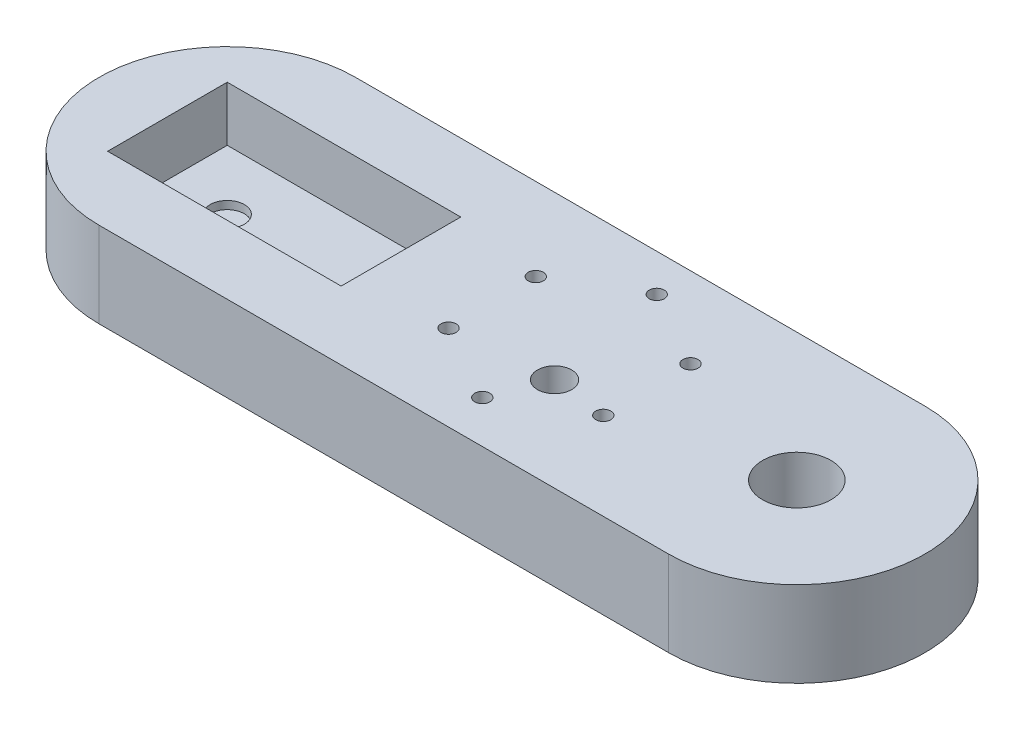
ISO-10303-21;
HEADER;
FILE_DESCRIPTION(('STEP AP214'),'2;1');
FILE_NAME('part.step','',(''),(''),'','','');
FILE_SCHEMA(('AUTOMOTIVE_DESIGN { 1 0 10303 214 1 1 1 1 }'));
ENDSEC;
DATA;
#1=APPLICATION_CONTEXT('core data for automotive mechanical design processes');
#2=APPLICATION_PROTOCOL_DEFINITION('international standard','automotive_design',2000,#1);
#3=PRODUCT_CONTEXT('',#1,'mechanical');
#4=PRODUCT('Part','Part','',(#3));
#5=PRODUCT_RELATED_PRODUCT_CATEGORY('part','',(#4));
#6=PRODUCT_DEFINITION_FORMATION('','',#4);
#7=PRODUCT_DEFINITION_CONTEXT('part definition',#1,'design');
#8=PRODUCT_DEFINITION('design','',#6,#7);
#9=PRODUCT_DEFINITION_SHAPE('','',#8);
#10=(LENGTH_UNIT() NAMED_UNIT(*) SI_UNIT(.MILLI.,.METRE.));
#11=(NAMED_UNIT(*) PLANE_ANGLE_UNIT() SI_UNIT($,.RADIAN.));
#12=(NAMED_UNIT(*) SI_UNIT($,.STERADIAN.) SOLID_ANGLE_UNIT());
#13=UNCERTAINTY_MEASURE_WITH_UNIT(LENGTH_MEASURE(1.E-05),#10,'distance_accuracy_value','');
#14=(GEOMETRIC_REPRESENTATION_CONTEXT(3) GLOBAL_UNCERTAINTY_ASSIGNED_CONTEXT((#13)) GLOBAL_UNIT_ASSIGNED_CONTEXT((#10,
#11,#12)) REPRESENTATION_CONTEXT('',''));
#15=CARTESIAN_POINT('',(0.,0.,0.));
#16=DIRECTION('',(0.,0.,1.));
#17=DIRECTION('',(1.,0.,0.));
#18=AXIS2_PLACEMENT_3D('',#15,#16,#17);
#19=CARTESIAN_POINT('',(0.,-8.48528137423855,0.));
#20=DIRECTION('',(0.,1.,0.));
#21=DIRECTION('',(0.,0.,1.));
#22=AXIS2_PLACEMENT_3D('',#19,#20,#21);
#23=CYLINDRICAL_SURFACE('',#22,3.);
#24=CARTESIAN_POINT('',(0.,5.4,0.));
#25=DIRECTION('',(0.,1.,0.));
#26=DIRECTION('',(0.,0.,1.));
#27=AXIS2_PLACEMENT_3D('',#24,#25,#26);
#28=CIRCLE('',#27,3.);
#29=CARTESIAN_POINT('',(0.,5.4,3.));
#30=VERTEX_POINT('',#29);
#31=EDGE_CURVE('E200',#30,#30,#28,.F.);
#32=ORIENTED_EDGE('',*,*,#31,.F.);
#33=EDGE_LOOP('',(#32));
#34=FACE_BOUND('',#33,.T.);
#35=DIRECTION('',(0.,1.,0.));
#36=VECTOR('',#35,1.);
#37=CARTESIAN_POINT('',(2.5,-8.48528137423855,1.6583123951777));
#38=LINE('',#37,#36);
#39=CARTESIAN_POINT('',(2.5,4.,1.6583123951777));
#40=VERTEX_POINT('',#39);
#41=CARTESIAN_POINT('',(2.5,0.,1.6583123951777));
#42=VERTEX_POINT('',#41);
#43=EDGE_CURVE('E11',#40,#42,#38,.F.);
#44=ORIENTED_EDGE('',*,*,#43,.F.);
#45=CARTESIAN_POINT('',(0.,4.,0.));
#46=DIRECTION('',(0.,1.,0.));
#47=DIRECTION('',(0.,0.,1.));
#48=AXIS2_PLACEMENT_3D('',#45,#46,#47);
#49=CIRCLE('',#48,3.);
#50=CARTESIAN_POINT('',(2.5,4.,-1.6583123951777));
#51=VERTEX_POINT('',#50);
#52=EDGE_CURVE('E48',#40,#51,#49,.F.);
#53=ORIENTED_EDGE('',*,*,#52,.T.);
#54=DIRECTION('',(0.,1.,0.));
#55=VECTOR('',#54,1.);
#56=CARTESIAN_POINT('',(2.5,-8.48528137423855,-1.6583123951777));
#57=LINE('',#56,#55);
#58=CARTESIAN_POINT('',(2.5,0.,-1.6583123951777));
#59=VERTEX_POINT('',#58);
#60=EDGE_CURVE('E191',#59,#51,#57,.T.);
#61=ORIENTED_EDGE('',*,*,#60,.F.);
#62=CARTESIAN_POINT('',(0.,0.,0.));
#63=DIRECTION('',(0.,1.,0.));
#64=DIRECTION('',(-1.,0.,0.));
#65=AXIS2_PLACEMENT_3D('',#62,#63,#64);
#66=CIRCLE('',#65,3.);
#67=EDGE_CURVE('E202',#59,#42,#66,.F.);
#68=ORIENTED_EDGE('',*,*,#67,.T.);
#69=EDGE_LOOP('',(#44,#53,#61,#68));
#70=FACE_BOUND('',#69,.T.);
#71=ADVANCED_FACE('F39',(#34,#70),#23,.F.);
#72=CARTESIAN_POINT('',(0.,15.,0.));
#73=DIRECTION('',(0.,-1.,0.));
#74=DIRECTION('',(0.,0.,-1.));
#75=AXIS2_PLACEMENT_3D('',#72,#73,#74);
#76=CYLINDRICAL_SURFACE('',#75,22.5);
#77=CARTESIAN_POINT('',(0.,0.,0.));
#78=DIRECTION('',(0.,1.,0.));
#79=DIRECTION('',(0.,0.,1.));
#80=AXIS2_PLACEMENT_3D('',#77,#78,#79);
#81=CIRCLE('',#80,22.5);
#82=CARTESIAN_POINT('',(0.,0.,-22.5));
#83=VERTEX_POINT('',#82);
#84=CARTESIAN_POINT('',(-18.7082869338697,0.,-12.5));
#85=VERTEX_POINT('',#84);
#86=EDGE_CURVE('E332',#83,#85,#81,.T.);
#87=ORIENTED_EDGE('',*,*,#86,.T.);
#88=DIRECTION('',(0.,-1.,0.));
#89=VECTOR('',#88,1.);
#90=CARTESIAN_POINT('',(-18.7082869338697,15.,-12.5));
#91=LINE('',#90,#89);
#92=CARTESIAN_POINT('',(-18.7082869338697,4.,-12.5));
#93=VERTEX_POINT('',#92);
#94=EDGE_CURVE('E151',#85,#93,#91,.F.);
#95=ORIENTED_EDGE('',*,*,#94,.T.);
#96=CARTESIAN_POINT('',(0.,4.,0.));
#97=DIRECTION('',(0.,1.,0.));
#98=DIRECTION('',(0.,0.,1.));
#99=AXIS2_PLACEMENT_3D('',#96,#97,#98);
#100=CIRCLE('',#99,22.5);
#101=CARTESIAN_POINT('',(-18.7082869338697,4.,12.5));
#102=VERTEX_POINT('',#101);
#103=EDGE_CURVE('E399',#93,#102,#100,.T.);
#104=ORIENTED_EDGE('',*,*,#103,.T.);
#105=DIRECTION('',(0.,-1.,0.));
#106=VECTOR('',#105,1.);
#107=CARTESIAN_POINT('',(-18.7082869338697,15.,12.5));
#108=LINE('',#107,#106);
#109=CARTESIAN_POINT('',(-18.7082869338697,0.,12.5));
#110=VERTEX_POINT('',#109);
#111=EDGE_CURVE('E397',#102,#110,#108,.T.);
#112=ORIENTED_EDGE('',*,*,#111,.T.);
#113=CARTESIAN_POINT('',(0.,0.,22.5));
#114=VERTEX_POINT('',#113);
#115=EDGE_CURVE('E358',#110,#114,#81,.T.);
#116=ORIENTED_EDGE('',*,*,#115,.T.);
#117=DIRECTION('',(0.,-1.,0.));
#118=VECTOR('',#117,1.);
#119=CARTESIAN_POINT('',(0.,15.,22.5));
#120=LINE('',#119,#118);
#121=CARTESIAN_POINT('',(0.,15.,22.5));
#122=VERTEX_POINT('',#121);
#123=EDGE_CURVE('E192',#122,#114,#120,.T.);
#124=ORIENTED_EDGE('',*,*,#123,.F.);
#125=CARTESIAN_POINT('',(0.,15.,0.));
#126=DIRECTION('',(0.,1.,0.));
#127=DIRECTION('',(0.,0.,1.));
#128=AXIS2_PLACEMENT_3D('',#125,#126,#127);
#129=CIRCLE('',#128,22.5);
#130=CARTESIAN_POINT('',(0.,15.,-22.5));
#131=VERTEX_POINT('',#130);
#132=EDGE_CURVE('E341',#131,#122,#129,.T.);
#133=ORIENTED_EDGE('',*,*,#132,.F.);
#134=DIRECTION('',(0.,-1.,0.));
#135=VECTOR('',#134,1.);
#136=CARTESIAN_POINT('',(0.,15.,-22.5));
#137=LINE('',#136,#135);
#138=EDGE_CURVE('E345',#131,#83,#137,.T.);
#139=ORIENTED_EDGE('',*,*,#138,.T.);
#140=EDGE_LOOP('',(#87,#95,#104,#112,#116,#124,#133,#139));
#141=FACE_BOUND('',#140,.T.);
#142=ADVANCED_FACE('F41',(#141),#76,.T.);
#143=CARTESIAN_POINT('',(0.,15.,22.5));
#144=DIRECTION('',(0.,0.,-1.));
#145=DIRECTION('',(-1.,0.,0.));
#146=AXIS2_PLACEMENT_3D('',#143,#144,#145);
#147=PLANE('',#146);
#148=DIRECTION('',(1.,0.,0.));
#149=VECTOR('',#148,1.);
#150=CARTESIAN_POINT('',(0.,0.,22.5));
#151=LINE('',#150,#149);
#152=CARTESIAN_POINT('',(100.,0.,22.5));
#153=VERTEX_POINT('',#152);
#154=EDGE_CURVE('E326',#114,#153,#151,.T.);
#155=ORIENTED_EDGE('',*,*,#154,.T.);
#156=DIRECTION('',(0.,-1.,0.));
#157=VECTOR('',#156,1.);
#158=CARTESIAN_POINT('',(100.,15.,22.5));
#159=LINE('',#158,#157);
#160=CARTESIAN_POINT('',(100.,15.,22.5));
#161=VERTEX_POINT('',#160);
#162=EDGE_CURVE('E196',#161,#153,#159,.T.);
#163=ORIENTED_EDGE('',*,*,#162,.F.);
#164=DIRECTION('',(1.,0.,0.));
#165=VECTOR('',#164,1.);
#166=CARTESIAN_POINT('',(0.,15.,22.5));
#167=LINE('',#166,#165);
#168=EDGE_CURVE('E355',#122,#161,#167,.T.);
#169=ORIENTED_EDGE('',*,*,#168,.F.);
#170=ORIENTED_EDGE('',*,*,#123,.T.);
#171=EDGE_LOOP('',(#155,#163,#169,#170));
#172=FACE_BOUND('',#171,.T.);
#173=ADVANCED_FACE('F294',(#172),#147,.F.);
#174=CARTESIAN_POINT('',(100.,15.,0.));
#175=DIRECTION('',(0.,-1.,0.));
#176=DIRECTION('',(0.,0.,-1.));
#177=AXIS2_PLACEMENT_3D('',#174,#175,#176);
#178=CYLINDRICAL_SURFACE('',#177,22.5);
#179=CARTESIAN_POINT('',(100.,0.,0.));
#180=DIRECTION('',(0.,1.,0.));
#181=DIRECTION('',(0.,0.,1.));
#182=AXIS2_PLACEMENT_3D('',#179,#180,#181);
#183=CIRCLE('',#182,22.5);
#184=CARTESIAN_POINT('',(100.,0.,-22.5));
#185=VERTEX_POINT('',#184);
#186=EDGE_CURVE('E331',#153,#185,#183,.T.);
#187=ORIENTED_EDGE('',*,*,#186,.T.);
#188=DIRECTION('',(0.,-1.,0.));
#189=VECTOR('',#188,1.);
#190=CARTESIAN_POINT('',(100.,15.,-22.5));
#191=LINE('',#190,#189);
#192=CARTESIAN_POINT('',(100.,15.,-22.5));
#193=VERTEX_POINT('',#192);
#194=EDGE_CURVE('E337',#193,#185,#191,.T.);
#195=ORIENTED_EDGE('',*,*,#194,.F.);
#196=CARTESIAN_POINT('',(100.,15.,0.));
#197=DIRECTION('',(0.,1.,0.));
#198=DIRECTION('',(0.,0.,1.));
#199=AXIS2_PLACEMENT_3D('',#196,#197,#198);
#200=CIRCLE('',#199,22.5);
#201=EDGE_CURVE('E336',#161,#193,#200,.T.);
#202=ORIENTED_EDGE('',*,*,#201,.F.);
#203=ORIENTED_EDGE('',*,*,#162,.T.);
#204=EDGE_LOOP('',(#187,#195,#202,#203));
#205=FACE_BOUND('',#204,.T.);
#206=ADVANCED_FACE('F315',(#205),#178,.T.);
#207=CARTESIAN_POINT('',(0.,15.,-22.5));
#208=DIRECTION('',(0.,0.,1.));
#209=DIRECTION('',(1.,0.,0.));
#210=AXIS2_PLACEMENT_3D('',#207,#208,#209);
#211=PLANE('',#210);
#212=DIRECTION('',(-1.,0.,0.));
#213=VECTOR('',#212,1.);
#214=CARTESIAN_POINT('',(0.,0.,-22.5));
#215=LINE('',#214,#213);
#216=EDGE_CURVE('E339',#185,#83,#215,.T.);
#217=ORIENTED_EDGE('',*,*,#216,.T.);
#218=ORIENTED_EDGE('',*,*,#138,.F.);
#219=DIRECTION('',(-1.,0.,0.));
#220=VECTOR('',#219,1.);
#221=CARTESIAN_POINT('',(0.,15.,-22.5));
#222=LINE('',#221,#220);
#223=EDGE_CURVE('E348',#193,#131,#222,.T.);
#224=ORIENTED_EDGE('',*,*,#223,.F.);
#225=ORIENTED_EDGE('',*,*,#194,.T.);
#226=EDGE_LOOP('',(#217,#218,#224,#225));
#227=FACE_BOUND('',#226,.T.);
#228=ADVANCED_FACE('F310',(#227),#211,.F.);
#229=CARTESIAN_POINT('',(0.,15.,0.));
#230=DIRECTION('',(0.,1.,0.));
#231=DIRECTION('',(0.,0.,1.));
#232=AXIS2_PLACEMENT_3D('',#229,#230,#231);
#233=PLANE('',#232);
#234=CARTESIAN_POINT('',(59.4694543473453,15.,-15.9397721773031));
#235=DIRECTION('',(0.,-1.,0.));
#236=DIRECTION('',(0.,0.,-1.));
#237=AXIS2_PLACEMENT_3D('',#234,#235,#236);
#238=CIRCLE('',#237,1.32501182149046);
#239=CARTESIAN_POINT('',(59.4694543473453,15.,-17.2647839987936));
#240=VERTEX_POINT('',#239);
#241=EDGE_CURVE('E231',#240,#240,#238,.T.);
#242=ORIENTED_EDGE('',*,*,#241,.T.);
#243=EDGE_LOOP('',(#242));
#244=FACE_BOUND('',#243,.T.);
#245=CARTESIAN_POINT('',(72.9840265990423,15.,-8.34988832748964));
#246=DIRECTION('',(0.,-1.,0.));
#247=DIRECTION('',(0.,0.,-1.));
#248=AXIS2_PLACEMENT_3D('',#245,#246,#247);
#249=CIRCLE('',#248,1.32501182149055);
#250=CARTESIAN_POINT('',(72.9840265990423,15.,-9.67490014898019));
#251=VERTEX_POINT('',#250);
#252=EDGE_CURVE('E237',#251,#251,#249,.T.);
#253=ORIENTED_EDGE('',*,*,#252,.T.);
#254=EDGE_LOOP('',(#253));
#255=FACE_BOUND('',#254,.T.);
#256=CARTESIAN_POINT('',(73.1682804991791,15.,7.14901648866706));
#257=DIRECTION('',(0.,-1.,0.));
#258=DIRECTION('',(0.,0.,-1.));
#259=AXIS2_PLACEMENT_3D('',#256,#257,#258);
#260=CIRCLE('',#259,1.32501182149096);
#261=CARTESIAN_POINT('',(73.1682804991791,15.,5.8240046671761));
#262=VERTEX_POINT('',#261);
#263=EDGE_CURVE('E243',#262,#262,#260,.T.);
#264=ORIENTED_EDGE('',*,*,#263,.T.);
#265=EDGE_LOOP('',(#264));
#266=FACE_BOUND('',#265,.T.);
#267=CARTESIAN_POINT('',(59.8379621476188,15.,15.0580374550102));
#268=DIRECTION('',(0.,-1.,0.));
#269=DIRECTION('',(0.,0.,-1.));
#270=AXIS2_PLACEMENT_3D('',#267,#268,#269);
#271=CIRCLE('',#270,1.32501182149128);
#272=CARTESIAN_POINT('',(59.8379621476188,15.,13.7330256335189));
#273=VERTEX_POINT('',#272);
#274=EDGE_CURVE('E249',#273,#273,#271,.T.);
#275=ORIENTED_EDGE('',*,*,#274,.T.);
#276=EDGE_LOOP('',(#275));
#277=FACE_BOUND('',#276,.T.);
#278=CARTESIAN_POINT('',(46.3233898959218,15.,7.46815360519682));
#279=DIRECTION('',(0.,-1.,0.));
#280=DIRECTION('',(0.,0.,-1.));
#281=AXIS2_PLACEMENT_3D('',#278,#279,#280);
#282=CIRCLE('',#281,1.32501182149119);
#283=CARTESIAN_POINT('',(46.3233898959218,15.,6.14314178370564));
#284=VERTEX_POINT('',#283);
#285=EDGE_CURVE('E226',#284,#284,#282,.T.);
#286=ORIENTED_EDGE('',*,*,#285,.T.);
#287=EDGE_LOOP('',(#286));
#288=FACE_BOUND('',#287,.T.);
#289=CARTESIAN_POINT('',(46.1391359957849,15.,-8.03075121095988));
#290=DIRECTION('',(0.,-1.,0.));
#291=DIRECTION('',(0.,0.,-1.));
#292=AXIS2_PLACEMENT_3D('',#289,#290,#291);
#293=CIRCLE('',#292,1.32501182149078);
#294=CARTESIAN_POINT('',(46.1391359957849,15.,-9.35576303245066));
#295=VERTEX_POINT('',#294);
#296=EDGE_CURVE('E217',#295,#295,#293,.T.);
#297=ORIENTED_EDGE('',*,*,#296,.T.);
#298=EDGE_LOOP('',(#297));
#299=FACE_BOUND('',#298,.T.);
#300=CARTESIAN_POINT('',(63.4806538763577,15.,6.0092866799311));
#301=DIRECTION('',(0.,1.,0.));
#302=DIRECTION('',(0.,0.,1.));
#303=AXIS2_PLACEMENT_3D('',#300,#301,#302);
#304=CIRCLE('',#303,3.);
#305=CARTESIAN_POINT('',(63.4806538763577,15.,9.0092866799311));
#306=VERTEX_POINT('',#305);
#307=EDGE_CURVE('E213',#306,#306,#304,.T.);
#308=ORIENTED_EDGE('',*,*,#307,.F.);
#309=EDGE_LOOP('',(#308));
#310=FACE_BOUND('',#309,.T.);
#311=CARTESIAN_POINT('',(100.,15.,0.));
#312=DIRECTION('',(0.,1.,0.));
#313=DIRECTION('',(0.,0.,1.));
#314=AXIS2_PLACEMENT_3D('',#311,#312,#313);
#315=CIRCLE('',#314,6.);
#316=CARTESIAN_POINT('',(100.,15.,6.));
#317=VERTEX_POINT('',#316);
#318=EDGE_CURVE('E163',#317,#317,#315,.T.);
#319=ORIENTED_EDGE('',*,*,#318,.F.);
#320=EDGE_LOOP('',(#319));
#321=FACE_BOUND('',#320,.T.);
#322=DIRECTION('',(0.,0.,-1.));
#323=VECTOR('',#322,1.);
#324=CARTESIAN_POINT('',(30.5,15.,10.5));
#325=LINE('',#324,#323);
#326=CARTESIAN_POINT('',(30.5,15.,10.5));
#327=VERTEX_POINT('',#326);
#328=CARTESIAN_POINT('',(30.5,15.,-10.5));
#329=VERTEX_POINT('',#328);
#330=EDGE_CURVE('E386',#327,#329,#325,.T.);
#331=ORIENTED_EDGE('',*,*,#330,.F.);
#332=DIRECTION('',(-1.,0.,0.));
#333=VECTOR('',#332,1.);
#334=CARTESIAN_POINT('',(30.5,15.,10.5));
#335=LINE('',#334,#333);
#336=CARTESIAN_POINT('',(-10.5,15.,10.5));
#337=VERTEX_POINT('',#336);
#338=EDGE_CURVE('E376',#327,#337,#335,.T.);
#339=ORIENTED_EDGE('',*,*,#338,.T.);
#340=DIRECTION('',(0.,0.,-1.));
#341=VECTOR('',#340,1.);
#342=CARTESIAN_POINT('',(-10.5,15.,10.5));
#343=LINE('',#342,#341);
#344=CARTESIAN_POINT('',(-10.5,15.,-10.5));
#345=VERTEX_POINT('',#344);
#346=EDGE_CURVE('E380',#337,#345,#343,.T.);
#347=ORIENTED_EDGE('',*,*,#346,.T.);
#348=DIRECTION('',(-1.,0.,0.));
#349=VECTOR('',#348,1.);
#350=CARTESIAN_POINT('',(30.5,15.,-10.5));
#351=LINE('',#350,#349);
#352=EDGE_CURVE('E383',#329,#345,#351,.T.);
#353=ORIENTED_EDGE('',*,*,#352,.F.);
#354=EDGE_LOOP('',(#331,#339,#347,#353));
#355=FACE_BOUND('',#354,.T.);
#356=ORIENTED_EDGE('',*,*,#132,.T.);
#357=ORIENTED_EDGE('',*,*,#168,.T.);
#358=ORIENTED_EDGE('',*,*,#201,.T.);
#359=ORIENTED_EDGE('',*,*,#223,.T.);
#360=EDGE_LOOP('',(#356,#357,#358,#359));
#361=FACE_BOUND('',#360,.T.);
#362=ADVANCED_FACE('F258',(#244,#255,#266,#277,#288,#299,#310,#321,#355,#361),#233,.T.);
#363=CARTESIAN_POINT('',(0.,0.,0.));
#364=DIRECTION('',(0.,1.,0.));
#365=DIRECTION('',(0.,0.,1.));
#366=AXIS2_PLACEMENT_3D('',#363,#364,#365);
#367=PLANE('',#366);
#368=CARTESIAN_POINT('',(59.4694543473453,0.,-15.9397721773031));
#369=DIRECTION('',(0.,-1.,0.));
#370=DIRECTION('',(0.,0.,-1.));
#371=AXIS2_PLACEMENT_3D('',#368,#369,#370);
#372=CIRCLE('',#371,1.32501182149046);
#373=CARTESIAN_POINT('',(59.4694543473453,0.,-17.2647839987936));
#374=VERTEX_POINT('',#373);
#375=EDGE_CURVE('E228',#374,#374,#372,.T.);
#376=ORIENTED_EDGE('',*,*,#375,.F.);
#377=EDGE_LOOP('',(#376));
#378=FACE_BOUND('',#377,.T.);
#379=CARTESIAN_POINT('',(72.9840265990423,0.,-8.34988832748964));
#380=DIRECTION('',(0.,-1.,0.));
#381=DIRECTION('',(0.,0.,-1.));
#382=AXIS2_PLACEMENT_3D('',#379,#380,#381);
#383=CIRCLE('',#382,1.32501182149055);
#384=CARTESIAN_POINT('',(72.9840265990423,0.,-9.67490014898019));
#385=VERTEX_POINT('',#384);
#386=EDGE_CURVE('E234',#385,#385,#383,.T.);
#387=ORIENTED_EDGE('',*,*,#386,.F.);
#388=EDGE_LOOP('',(#387));
#389=FACE_BOUND('',#388,.T.);
#390=CARTESIAN_POINT('',(73.1682804991791,0.,7.14901648866706));
#391=DIRECTION('',(0.,-1.,0.));
#392=DIRECTION('',(0.,0.,-1.));
#393=AXIS2_PLACEMENT_3D('',#390,#391,#392);
#394=CIRCLE('',#393,1.32501182149096);
#395=CARTESIAN_POINT('',(73.1682804991791,0.,5.8240046671761));
#396=VERTEX_POINT('',#395);
#397=EDGE_CURVE('E240',#396,#396,#394,.T.);
#398=ORIENTED_EDGE('',*,*,#397,.F.);
#399=EDGE_LOOP('',(#398));
#400=FACE_BOUND('',#399,.T.);
#401=CARTESIAN_POINT('',(59.8379621476188,0.,15.0580374550102));
#402=DIRECTION('',(0.,-1.,0.));
#403=DIRECTION('',(0.,0.,-1.));
#404=AXIS2_PLACEMENT_3D('',#401,#402,#403);
#405=CIRCLE('',#404,1.32501182149128);
#406=CARTESIAN_POINT('',(59.8379621476188,0.,13.7330256335189));
#407=VERTEX_POINT('',#406);
#408=EDGE_CURVE('E246',#407,#407,#405,.T.);
#409=ORIENTED_EDGE('',*,*,#408,.F.);
#410=EDGE_LOOP('',(#409));
#411=FACE_BOUND('',#410,.T.);
#412=CARTESIAN_POINT('',(46.3233898959218,0.,7.46815360519682));
#413=DIRECTION('',(0.,-1.,0.));
#414=DIRECTION('',(0.,0.,-1.));
#415=AXIS2_PLACEMENT_3D('',#412,#413,#414);
#416=CIRCLE('',#415,1.32501182149119);
#417=CARTESIAN_POINT('',(46.3233898959218,0.,6.14314178370564));
#418=VERTEX_POINT('',#417);
#419=EDGE_CURVE('E252',#418,#418,#416,.T.);
#420=ORIENTED_EDGE('',*,*,#419,.F.);
#421=EDGE_LOOP('',(#420));
#422=FACE_BOUND('',#421,.T.);
#423=CARTESIAN_POINT('',(46.1391359957849,0.,-8.03075121095988));
#424=DIRECTION('',(0.,-1.,0.));
#425=DIRECTION('',(0.,0.,-1.));
#426=AXIS2_PLACEMENT_3D('',#423,#424,#425);
#427=CIRCLE('',#426,1.32501182149078);
#428=CARTESIAN_POINT('',(46.1391359957849,0.,-9.35576303245066));
#429=VERTEX_POINT('',#428);
#430=EDGE_CURVE('E222',#429,#429,#427,.T.);
#431=ORIENTED_EDGE('',*,*,#430,.F.);
#432=EDGE_LOOP('',(#431));
#433=FACE_BOUND('',#432,.T.);
#434=CARTESIAN_POINT('',(63.4806538763577,0.,6.0092866799311));
#435=DIRECTION('',(0.,1.,0.));
#436=DIRECTION('',(0.,0.,1.));
#437=AXIS2_PLACEMENT_3D('',#434,#435,#436);
#438=CIRCLE('',#437,3.);
#439=CARTESIAN_POINT('',(63.4806538763577,0.,9.0092866799311));
#440=VERTEX_POINT('',#439);
#441=EDGE_CURVE('E43',#440,#440,#438,.T.);
#442=ORIENTED_EDGE('',*,*,#441,.T.);
#443=EDGE_LOOP('',(#442));
#444=FACE_BOUND('',#443,.T.);
#445=CARTESIAN_POINT('',(100.,0.,0.));
#446=DIRECTION('',(0.,1.,0.));
#447=DIRECTION('',(0.,0.,1.));
#448=AXIS2_PLACEMENT_3D('',#445,#446,#447);
#449=CIRCLE('',#448,6.);
#450=CARTESIAN_POINT('',(100.,0.,6.));
#451=VERTEX_POINT('',#450);
#452=EDGE_CURVE('E206',#451,#451,#449,.T.);
#453=ORIENTED_EDGE('',*,*,#452,.T.);
#454=EDGE_LOOP('',(#453));
#455=FACE_BOUND('',#454,.T.);
#456=DIRECTION('',(0.,0.,1.));
#457=VECTOR('',#456,1.);
#458=CARTESIAN_POINT('',(2.5,0.,-12.5));
#459=LINE('',#458,#457);
#460=CARTESIAN_POINT('',(2.5,0.,-12.5));
#461=VERTEX_POINT('',#460);
#462=CARTESIAN_POINT('',(2.5,0.,-9.68245836551854));
#463=VERTEX_POINT('',#462);
#464=EDGE_CURVE('E56',#461,#463,#459,.T.);
#465=ORIENTED_EDGE('',*,*,#464,.F.);
#466=DIRECTION('',(-1.,0.,0.));
#467=VECTOR('',#466,1.);
#468=CARTESIAN_POINT('',(2.5,0.,-12.5));
#469=LINE('',#468,#467);
#470=EDGE_CURVE('E146',#461,#85,#469,.T.);
#471=ORIENTED_EDGE('',*,*,#470,.T.);
#472=ORIENTED_EDGE('',*,*,#86,.F.);
#473=ORIENTED_EDGE('',*,*,#216,.F.);
#474=ORIENTED_EDGE('',*,*,#186,.F.);
#475=ORIENTED_EDGE('',*,*,#154,.F.);
#476=ORIENTED_EDGE('',*,*,#115,.F.);
#477=DIRECTION('',(-1.,0.,0.));
#478=VECTOR('',#477,1.);
#479=CARTESIAN_POINT('',(2.5,0.,12.5));
#480=LINE('',#479,#478);
#481=CARTESIAN_POINT('',(2.5,0.,12.5));
#482=VERTEX_POINT('',#481);
#483=EDGE_CURVE('E155',#482,#110,#480,.T.);
#484=ORIENTED_EDGE('',*,*,#483,.F.);
#485=CARTESIAN_POINT('',(2.5,0.,9.68245836551854));
#486=VERTEX_POINT('',#485);
#487=EDGE_CURVE('E162',#486,#482,#459,.T.);
#488=ORIENTED_EDGE('',*,*,#487,.F.);
#489=CARTESIAN_POINT('',(0.,0.,0.));
#490=DIRECTION('',(0.,1.,0.));
#491=DIRECTION('',(0.,0.,1.));
#492=AXIS2_PLACEMENT_3D('',#489,#490,#491);
#493=CIRCLE('',#492,10.);
#494=EDGE_CURVE('E169',#463,#486,#493,.F.);
#495=ORIENTED_EDGE('',*,*,#494,.F.);
#496=EDGE_LOOP('',(#465,#471,#472,#473,#474,#475,#476,#484,#488,#495));
#497=FACE_BOUND('',#496,.T.);
#498=ADVANCED_FACE('F166',(#378,#389,#400,#411,#422,#433,#444,#455,#497),#367,.F.);
#499=CARTESIAN_POINT('',(0.,-9.,0.));
#500=DIRECTION('',(0.,1.,0.));
#501=DIRECTION('',(0.,0.,1.));
#502=AXIS2_PLACEMENT_3D('',#499,#500,#501);
#503=CYLINDRICAL_SURFACE('',#502,10.);
#504=CARTESIAN_POINT('',(0.,-9.,0.));
#505=DIRECTION('',(0.,-1.,0.));
#506=DIRECTION('',(0.,0.,-1.));
#507=AXIS2_PLACEMENT_3D('',#504,#505,#506);
#508=CIRCLE('',#507,10.);
#509=CARTESIAN_POINT('',(0.,-9.,-10.));
#510=VERTEX_POINT('',#509);
#511=EDGE_CURVE('E359',#510,#510,#508,.T.);
#512=ORIENTED_EDGE('',*,*,#511,.F.);
#513=EDGE_LOOP('',(#512));
#514=FACE_BOUND('',#513,.T.);
#515=ORIENTED_EDGE('',*,*,#494,.T.);
#516=CARTESIAN_POINT('',(0.,0.,0.));
#517=DIRECTION('',(0.,-1.,0.));
#518=DIRECTION('',(0.,0.,-1.));
#519=AXIS2_PLACEMENT_3D('',#516,#517,#518);
#520=CIRCLE('',#519,10.);
#521=EDGE_CURVE('E190',#486,#463,#520,.T.);
#522=ORIENTED_EDGE('',*,*,#521,.T.);
#523=EDGE_LOOP('',(#515,#522));
#524=FACE_BOUND('',#523,.T.);
#525=ADVANCED_FACE('F189',(#514,#524),#503,.T.);
#526=CARTESIAN_POINT('',(0.,-9.,0.));
#527=DIRECTION('',(0.,-1.,0.));
#528=DIRECTION('',(0.,0.,-1.));
#529=AXIS2_PLACEMENT_3D('',#526,#527,#528);
#530=PLANE('',#529);
#531=ORIENTED_EDGE('',*,*,#511,.T.);
#532=EDGE_LOOP('',(#531));
#533=FACE_BOUND('',#532,.T.);
#534=ADVANCED_FACE('F302',(#533),#530,.T.);
#535=CARTESIAN_POINT('',(0.,5.4,0.));
#536=DIRECTION('',(0.,1.,0.));
#537=DIRECTION('',(0.,0.,1.));
#538=AXIS2_PLACEMENT_3D('',#535,#536,#537);
#539=PLANE('',#538);
#540=DIRECTION('',(0.,0.,-1.));
#541=VECTOR('',#540,1.);
#542=CARTESIAN_POINT('',(30.5,5.4,10.5));
#543=LINE('',#542,#541);
#544=CARTESIAN_POINT('',(30.5,5.4,10.5));
#545=VERTEX_POINT('',#544);
#546=CARTESIAN_POINT('',(30.5,5.4,-10.5));
#547=VERTEX_POINT('',#546);
#548=EDGE_CURVE('E379',#545,#547,#543,.T.);
#549=ORIENTED_EDGE('',*,*,#548,.T.);
#550=DIRECTION('',(-1.,0.,0.));
#551=VECTOR('',#550,1.);
#552=CARTESIAN_POINT('',(30.5,5.4,-10.5));
#553=LINE('',#552,#551);
#554=CARTESIAN_POINT('',(-10.5,5.4,-10.5));
#555=VERTEX_POINT('',#554);
#556=EDGE_CURVE('E391',#547,#555,#553,.T.);
#557=ORIENTED_EDGE('',*,*,#556,.T.);
#558=DIRECTION('',(0.,0.,-1.));
#559=VECTOR('',#558,1.);
#560=CARTESIAN_POINT('',(-10.5,5.4,10.5));
#561=LINE('',#560,#559);
#562=CARTESIAN_POINT('',(-10.5,5.4,10.5));
#563=VERTEX_POINT('',#562);
#564=EDGE_CURVE('E389',#563,#555,#561,.T.);
#565=ORIENTED_EDGE('',*,*,#564,.F.);
#566=DIRECTION('',(-1.,0.,0.));
#567=VECTOR('',#566,1.);
#568=CARTESIAN_POINT('',(30.5,5.4,10.5));
#569=LINE('',#568,#567);
#570=EDGE_CURVE('E371',#545,#563,#569,.T.);
#571=ORIENTED_EDGE('',*,*,#570,.F.);
#572=EDGE_LOOP('',(#549,#557,#565,#571));
#573=FACE_BOUND('',#572,.T.);
#574=ORIENTED_EDGE('',*,*,#31,.T.);
#575=EDGE_LOOP('',(#574));
#576=FACE_BOUND('',#575,.T.);
#577=ADVANCED_FACE('F304',(#573,#576),#539,.T.);
#578=CARTESIAN_POINT('',(30.5,5.4,10.5));
#579=DIRECTION('',(1.,0.,0.));
#580=DIRECTION('',(0.,0.,-1.));
#581=AXIS2_PLACEMENT_3D('',#578,#579,#580);
#582=PLANE('',#581);
#583=ORIENTED_EDGE('',*,*,#330,.T.);
#584=DIRECTION('',(0.,1.,0.));
#585=VECTOR('',#584,1.);
#586=CARTESIAN_POINT('',(30.5,5.4,-10.5));
#587=LINE('',#586,#585);
#588=EDGE_CURVE('E367',#547,#329,#587,.T.);
#589=ORIENTED_EDGE('',*,*,#588,.F.);
#590=ORIENTED_EDGE('',*,*,#548,.F.);
#591=DIRECTION('',(0.,1.,0.));
#592=VECTOR('',#591,1.);
#593=CARTESIAN_POINT('',(30.5,5.4,10.5));
#594=LINE('',#593,#592);
#595=EDGE_CURVE('E203',#545,#327,#594,.T.);
#596=ORIENTED_EDGE('',*,*,#595,.T.);
#597=EDGE_LOOP('',(#583,#589,#590,#596));
#598=FACE_BOUND('',#597,.T.);
#599=ADVANCED_FACE('F428',(#598),#582,.F.);
#600=CARTESIAN_POINT('',(30.5,5.4,10.5));
#601=DIRECTION('',(0.,0.,-1.));
#602=DIRECTION('',(-1.,0.,0.));
#603=AXIS2_PLACEMENT_3D('',#600,#601,#602);
#604=PLANE('',#603);
#605=ORIENTED_EDGE('',*,*,#338,.F.);
#606=ORIENTED_EDGE('',*,*,#595,.F.);
#607=ORIENTED_EDGE('',*,*,#570,.T.);
#608=DIRECTION('',(0.,1.,0.));
#609=VECTOR('',#608,1.);
#610=CARTESIAN_POINT('',(-10.5,5.4,10.5));
#611=LINE('',#610,#609);
#612=EDGE_CURVE('E373',#563,#337,#611,.T.);
#613=ORIENTED_EDGE('',*,*,#612,.T.);
#614=EDGE_LOOP('',(#605,#606,#607,#613));
#615=FACE_BOUND('',#614,.T.);
#616=ADVANCED_FACE('F424',(#615),#604,.T.);
#617=CARTESIAN_POINT('',(-10.5,5.4,10.5));
#618=DIRECTION('',(1.,0.,0.));
#619=DIRECTION('',(0.,0.,-1.));
#620=AXIS2_PLACEMENT_3D('',#617,#618,#619);
#621=PLANE('',#620);
#622=ORIENTED_EDGE('',*,*,#346,.F.);
#623=ORIENTED_EDGE('',*,*,#612,.F.);
#624=ORIENTED_EDGE('',*,*,#564,.T.);
#625=DIRECTION('',(0.,1.,0.));
#626=VECTOR('',#625,1.);
#627=CARTESIAN_POINT('',(-10.5,5.4,-10.5));
#628=LINE('',#627,#626);
#629=EDGE_CURVE('E370',#555,#345,#628,.T.);
#630=ORIENTED_EDGE('',*,*,#629,.T.);
#631=EDGE_LOOP('',(#622,#623,#624,#630));
#632=FACE_BOUND('',#631,.T.);
#633=ADVANCED_FACE('F418',(#632),#621,.T.);
#634=CARTESIAN_POINT('',(30.5,5.4,-10.5));
#635=DIRECTION('',(0.,0.,-1.));
#636=DIRECTION('',(-1.,0.,0.));
#637=AXIS2_PLACEMENT_3D('',#634,#635,#636);
#638=PLANE('',#637);
#639=ORIENTED_EDGE('',*,*,#352,.T.);
#640=ORIENTED_EDGE('',*,*,#629,.F.);
#641=ORIENTED_EDGE('',*,*,#556,.F.);
#642=ORIENTED_EDGE('',*,*,#588,.T.);
#643=EDGE_LOOP('',(#639,#640,#641,#642));
#644=FACE_BOUND('',#643,.T.);
#645=ADVANCED_FACE('F411',(#644),#638,.F.);
#646=CARTESIAN_POINT('',(-149.935232574258,0.,-4.40749735140582));
#647=DIRECTION('',(0.,1.,0.));
#648=DIRECTION('',(-0.029383315676065,0.,0.999568217161731));
#649=AXIS2_PLACEMENT_3D('',#646,#647,#648);
#650=PLANE('',#649);
#651=EDGE_CURVE('E174',#42,#486,#459,.T.);
#652=ORIENTED_EDGE('',*,*,#651,.F.);
#653=ORIENTED_EDGE('',*,*,#67,.F.);
#654=EDGE_CURVE('E60',#463,#59,#459,.T.);
#655=ORIENTED_EDGE('',*,*,#654,.F.);
#656=ORIENTED_EDGE('',*,*,#521,.F.);
#657=EDGE_LOOP('',(#652,#653,#655,#656));
#658=FACE_BOUND('',#657,.T.);
#659=ADVANCED_FACE('F300',(#658),#650,.T.);
#660=CARTESIAN_POINT('',(2.5,4.,-12.5));
#661=DIRECTION('',(0.,0.,-1.));
#662=DIRECTION('',(0.,1.,0.));
#663=AXIS2_PLACEMENT_3D('',#660,#661,#662);
#664=PLANE('',#663);
#665=ORIENTED_EDGE('',*,*,#470,.F.);
#666=DIRECTION('',(0.,-1.,0.));
#667=VECTOR('',#666,1.);
#668=CARTESIAN_POINT('',(2.5,4.,-12.5));
#669=LINE('',#668,#667);
#670=CARTESIAN_POINT('',(2.5,4.,-12.5));
#671=VERTEX_POINT('',#670);
#672=EDGE_CURVE('E149',#671,#461,#669,.T.);
#673=ORIENTED_EDGE('',*,*,#672,.F.);
#674=DIRECTION('',(-1.,0.,0.));
#675=VECTOR('',#674,1.);
#676=CARTESIAN_POINT('',(2.5,4.,-12.5));
#677=LINE('',#676,#675);
#678=EDGE_CURVE('E401',#671,#93,#677,.T.);
#679=ORIENTED_EDGE('',*,*,#678,.T.);
#680=ORIENTED_EDGE('',*,*,#94,.F.);
#681=EDGE_LOOP('',(#665,#673,#679,#680));
#682=FACE_BOUND('',#681,.T.);
#683=ADVANCED_FACE('F147',(#682),#664,.F.);
#684=CARTESIAN_POINT('',(2.5,4.,12.5));
#685=DIRECTION('',(0.,0.,1.));
#686=DIRECTION('',(0.,-1.,0.));
#687=AXIS2_PLACEMENT_3D('',#684,#685,#686);
#688=PLANE('',#687);
#689=DIRECTION('',(-1.,0.,0.));
#690=VECTOR('',#689,1.);
#691=CARTESIAN_POINT('',(2.5,4.,12.5));
#692=LINE('',#691,#690);
#693=CARTESIAN_POINT('',(2.5,4.,12.5));
#694=VERTEX_POINT('',#693);
#695=EDGE_CURVE('E404',#694,#102,#692,.T.);
#696=ORIENTED_EDGE('',*,*,#695,.F.);
#697=DIRECTION('',(0.,1.,0.));
#698=VECTOR('',#697,1.);
#699=CARTESIAN_POINT('',(2.5,4.,12.5));
#700=LINE('',#699,#698);
#701=EDGE_CURVE('E170',#482,#694,#700,.T.);
#702=ORIENTED_EDGE('',*,*,#701,.F.);
#703=ORIENTED_EDGE('',*,*,#483,.T.);
#704=ORIENTED_EDGE('',*,*,#111,.F.);
#705=EDGE_LOOP('',(#696,#702,#703,#704));
#706=FACE_BOUND('',#705,.T.);
#707=ADVANCED_FACE('F416',(#706),#688,.F.);
#708=CARTESIAN_POINT('',(2.5,4.,-12.5));
#709=DIRECTION('',(0.,1.,0.));
#710=DIRECTION('',(0.,0.,1.));
#711=AXIS2_PLACEMENT_3D('',#708,#709,#710);
#712=PLANE('',#711);
#713=ORIENTED_EDGE('',*,*,#678,.F.);
#714=DIRECTION('',(0.,0.,-1.));
#715=VECTOR('',#714,1.);
#716=CARTESIAN_POINT('',(2.5,4.,-12.5));
#717=LINE('',#716,#715);
#718=EDGE_CURVE('E160',#51,#671,#717,.T.);
#719=ORIENTED_EDGE('',*,*,#718,.F.);
#720=ORIENTED_EDGE('',*,*,#52,.F.);
#721=EDGE_CURVE('E156',#694,#40,#717,.T.);
#722=ORIENTED_EDGE('',*,*,#721,.F.);
#723=ORIENTED_EDGE('',*,*,#695,.T.);
#724=ORIENTED_EDGE('',*,*,#103,.F.);
#725=EDGE_LOOP('',(#713,#719,#720,#722,#723,#724));
#726=FACE_BOUND('',#725,.T.);
#727=ADVANCED_FACE('F454',(#726),#712,.F.);
#728=CARTESIAN_POINT('',(2.5,0.,0.));
#729=DIRECTION('',(-1.,0.,0.));
#730=DIRECTION('',(0.,0.,1.));
#731=AXIS2_PLACEMENT_3D('',#728,#729,#730);
#732=PLANE('',#731);
#733=ORIENTED_EDGE('',*,*,#43,.T.);
#734=ORIENTED_EDGE('',*,*,#651,.T.);
#735=ORIENTED_EDGE('',*,*,#487,.T.);
#736=ORIENTED_EDGE('',*,*,#701,.T.);
#737=ORIENTED_EDGE('',*,*,#721,.T.);
#738=EDGE_LOOP('',(#733,#734,#735,#736,#737));
#739=FACE_BOUND('',#738,.T.);
#740=ADVANCED_FACE('F179',(#739),#732,.T.);
#741=ORIENTED_EDGE('',*,*,#60,.T.);
#742=ORIENTED_EDGE('',*,*,#718,.T.);
#743=ORIENTED_EDGE('',*,*,#672,.T.);
#744=ORIENTED_EDGE('',*,*,#464,.T.);
#745=ORIENTED_EDGE('',*,*,#654,.T.);
#746=EDGE_LOOP('',(#741,#742,#743,#744,#745));
#747=FACE_BOUND('',#746,.T.);
#748=ADVANCED_FACE('F158',(#747),#732,.T.);
#749=CARTESIAN_POINT('',(100.,-9.,0.));
#750=DIRECTION('',(0.,1.,0.));
#751=DIRECTION('',(0.,0.,1.));
#752=AXIS2_PLACEMENT_3D('',#749,#750,#751);
#753=CYLINDRICAL_SURFACE('',#752,6.);
#754=ORIENTED_EDGE('',*,*,#318,.T.);
#755=EDGE_LOOP('',(#754));
#756=FACE_BOUND('',#755,.T.);
#757=ORIENTED_EDGE('',*,*,#452,.F.);
#758=EDGE_LOOP('',(#757));
#759=FACE_BOUND('',#758,.T.);
#760=ADVANCED_FACE('F282',(#756,#759),#753,.F.);
#761=CARTESIAN_POINT('',(63.4806538763577,-9.,6.0092866799311));
#762=DIRECTION('',(0.,1.,0.));
#763=DIRECTION('',(0.,0.,1.));
#764=AXIS2_PLACEMENT_3D('',#761,#762,#763);
#765=CYLINDRICAL_SURFACE('',#764,3.);
#766=ORIENTED_EDGE('',*,*,#307,.T.);
#767=EDGE_LOOP('',(#766));
#768=FACE_BOUND('',#767,.T.);
#769=ORIENTED_EDGE('',*,*,#441,.F.);
#770=EDGE_LOOP('',(#769));
#771=FACE_BOUND('',#770,.T.);
#772=ADVANCED_FACE('F276',(#768,#771),#765,.F.);
#773=CARTESIAN_POINT('',(46.1391359957849,15.,-8.03075121095988));
#774=DIRECTION('',(0.,-1.,0.));
#775=DIRECTION('',(0.,0.,-1.));
#776=AXIS2_PLACEMENT_3D('',#773,#774,#775);
#777=CYLINDRICAL_SURFACE('',#776,1.32501182149078);
#778=ORIENTED_EDGE('',*,*,#296,.F.);
#779=EDGE_LOOP('',(#778));
#780=FACE_BOUND('',#779,.T.);
#781=ORIENTED_EDGE('',*,*,#430,.T.);
#782=EDGE_LOOP('',(#781));
#783=FACE_BOUND('',#782,.T.);
#784=ADVANCED_FACE('F265',(#780,#783),#777,.F.);
#785=CARTESIAN_POINT('',(46.3233898959218,15.,7.46815360519682));
#786=DIRECTION('',(0.,-1.,0.));
#787=DIRECTION('',(0.,0.,-1.));
#788=AXIS2_PLACEMENT_3D('',#785,#786,#787);
#789=CYLINDRICAL_SURFACE('',#788,1.32501182149119);
#790=ORIENTED_EDGE('',*,*,#285,.F.);
#791=EDGE_LOOP('',(#790));
#792=FACE_BOUND('',#791,.T.);
#793=ORIENTED_EDGE('',*,*,#419,.T.);
#794=EDGE_LOOP('',(#793));
#795=FACE_BOUND('',#794,.T.);
#796=ADVANCED_FACE('F261',(#792,#795),#789,.F.);
#797=CARTESIAN_POINT('',(59.8379621476188,15.,15.0580374550102));
#798=DIRECTION('',(0.,-1.,0.));
#799=DIRECTION('',(0.,0.,-1.));
#800=AXIS2_PLACEMENT_3D('',#797,#798,#799);
#801=CYLINDRICAL_SURFACE('',#800,1.32501182149128);
#802=ORIENTED_EDGE('',*,*,#274,.F.);
#803=EDGE_LOOP('',(#802));
#804=FACE_BOUND('',#803,.T.);
#805=ORIENTED_EDGE('',*,*,#408,.T.);
#806=EDGE_LOOP('',(#805));
#807=FACE_BOUND('',#806,.T.);
#808=ADVANCED_FACE('F264',(#804,#807),#801,.F.);
#809=CARTESIAN_POINT('',(73.1682804991791,15.,7.14901648866706));
#810=DIRECTION('',(0.,-1.,0.));
#811=DIRECTION('',(0.,0.,-1.));
#812=AXIS2_PLACEMENT_3D('',#809,#810,#811);
#813=CYLINDRICAL_SURFACE('',#812,1.32501182149096);
#814=ORIENTED_EDGE('',*,*,#263,.F.);
#815=EDGE_LOOP('',(#814));
#816=FACE_BOUND('',#815,.T.);
#817=ORIENTED_EDGE('',*,*,#397,.T.);
#818=EDGE_LOOP('',(#817));
#819=FACE_BOUND('',#818,.T.);
#820=ADVANCED_FACE('F583',(#816,#819),#813,.F.);
#821=CARTESIAN_POINT('',(72.9840265990423,15.,-8.34988832748964));
#822=DIRECTION('',(0.,-1.,0.));
#823=DIRECTION('',(0.,0.,-1.));
#824=AXIS2_PLACEMENT_3D('',#821,#822,#823);
#825=CYLINDRICAL_SURFACE('',#824,1.32501182149055);
#826=ORIENTED_EDGE('',*,*,#252,.F.);
#827=EDGE_LOOP('',(#826));
#828=FACE_BOUND('',#827,.T.);
#829=ORIENTED_EDGE('',*,*,#386,.T.);
#830=EDGE_LOOP('',(#829));
#831=FACE_BOUND('',#830,.T.);
#832=ADVANCED_FACE('F593',(#828,#831),#825,.F.);
#833=CARTESIAN_POINT('',(59.4694543473453,15.,-15.9397721773031));
#834=DIRECTION('',(0.,-1.,0.));
#835=DIRECTION('',(0.,0.,-1.));
#836=AXIS2_PLACEMENT_3D('',#833,#834,#835);
#837=CYLINDRICAL_SURFACE('',#836,1.32501182149046);
#838=ORIENTED_EDGE('',*,*,#241,.F.);
#839=EDGE_LOOP('',(#838));
#840=FACE_BOUND('',#839,.T.);
#841=ORIENTED_EDGE('',*,*,#375,.T.);
#842=EDGE_LOOP('',(#841));
#843=FACE_BOUND('',#842,.T.);
#844=ADVANCED_FACE('F603',(#840,#843),#837,.F.);
#845=CLOSED_SHELL('',(#71,#142,#173,#206,#228,#362,#498,#525,#534,#577,#599,#616,#633,#645,#659,
#683,#707,#727,#740,#748,#760,#772,#784,#796,#808,#820,#832,#844));
#846=MANIFOLD_SOLID_BREP('B2',#845);
#847=ADVANCED_BREP_SHAPE_REPRESENTATION('',(#18,#846),#14);
#848=SHAPE_DEFINITION_REPRESENTATION(#9,#847);
ENDSEC;
END-ISO-10303-21;
